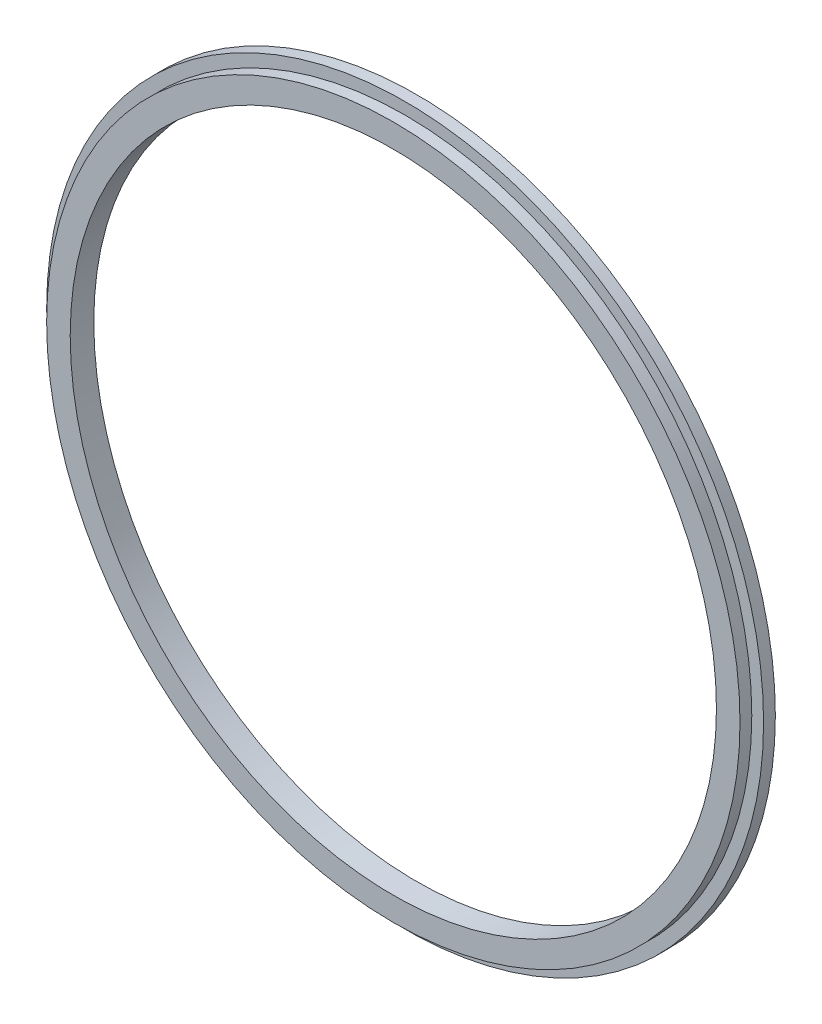
ISO-10303-21;
HEADER;
FILE_DESCRIPTION(('STEP AP214'),'2;1');
FILE_NAME('part.step','',(''),(''),'','','');
FILE_SCHEMA(('AUTOMOTIVE_DESIGN { 1 0 10303 214 1 1 1 1 }'));
ENDSEC;
DATA;
#1=APPLICATION_CONTEXT('core data for automotive mechanical design processes');
#2=APPLICATION_PROTOCOL_DEFINITION('international standard','automotive_design',2000,#1);
#3=PRODUCT_CONTEXT('',#1,'mechanical');
#4=PRODUCT('Part','Part','',(#3));
#5=PRODUCT_RELATED_PRODUCT_CATEGORY('part','',(#4));
#6=PRODUCT_DEFINITION_FORMATION('','',#4);
#7=PRODUCT_DEFINITION_CONTEXT('part definition',#1,'design');
#8=PRODUCT_DEFINITION('design','',#6,#7);
#9=PRODUCT_DEFINITION_SHAPE('','',#8);
#10=(LENGTH_UNIT() NAMED_UNIT(*) SI_UNIT(.MILLI.,.METRE.));
#11=(NAMED_UNIT(*) PLANE_ANGLE_UNIT() SI_UNIT($,.RADIAN.));
#12=(NAMED_UNIT(*) SI_UNIT($,.STERADIAN.) SOLID_ANGLE_UNIT());
#13=UNCERTAINTY_MEASURE_WITH_UNIT(LENGTH_MEASURE(1.E-05),#10,'distance_accuracy_value','');
#14=(GEOMETRIC_REPRESENTATION_CONTEXT(3) GLOBAL_UNCERTAINTY_ASSIGNED_CONTEXT((#13)) GLOBAL_UNIT_ASSIGNED_CONTEXT((#10,
#11,#12)) REPRESENTATION_CONTEXT('',''));
#15=CARTESIAN_POINT('',(0.,0.,0.));
#16=DIRECTION('',(0.,0.,1.));
#17=DIRECTION('',(1.,0.,0.));
#18=AXIS2_PLACEMENT_3D('',#15,#16,#17);
#19=CARTESIAN_POINT('',(0.,0.,2.));
#20=DIRECTION('',(0.,0.,1.));
#21=DIRECTION('',(1.,0.,0.));
#22=AXIS2_PLACEMENT_3D('',#19,#20,#21);
#23=PLANE('',#22);
#24=CARTESIAN_POINT('',(0.,0.,2.));
#25=DIRECTION('',(0.,0.,1.));
#26=DIRECTION('',(1.,0.,0.));
#27=AXIS2_PLACEMENT_3D('',#24,#25,#26);
#28=CIRCLE('',#27,58.829);
#29=CARTESIAN_POINT('',(58.829,0.,2.));
#30=VERTEX_POINT('',#29);
#31=EDGE_CURVE('E10',#30,#30,#28,.T.);
#32=ORIENTED_EDGE('',*,*,#31,.T.);
#33=EDGE_LOOP('',(#32));
#34=FACE_BOUND('',#33,.T.);
#35=CARTESIAN_POINT('',(0.,0.,2.));
#36=DIRECTION('',(0.,0.,1.));
#37=DIRECTION('',(1.,0.,0.));
#38=AXIS2_PLACEMENT_3D('',#35,#36,#37);
#39=CIRCLE('',#38,54.829);
#40=CARTESIAN_POINT('',(54.829,0.,2.));
#41=VERTEX_POINT('',#40);
#42=EDGE_CURVE('E49',#41,#41,#39,.T.);
#43=ORIENTED_EDGE('',*,*,#42,.F.);
#44=EDGE_LOOP('',(#43));
#45=FACE_BOUND('',#44,.T.);
#46=ADVANCED_FACE('F40',(#34,#45),#23,.T.);
#47=CARTESIAN_POINT('',(0.,0.,2.));
#48=DIRECTION('',(0.,0.,-1.));
#49=DIRECTION('',(-1.,0.,0.));
#50=AXIS2_PLACEMENT_3D('',#47,#48,#49);
#51=CYLINDRICAL_SURFACE('',#50,58.829);
#52=ORIENTED_EDGE('',*,*,#31,.F.);
#53=EDGE_LOOP('',(#52));
#54=FACE_BOUND('',#53,.T.);
#55=CARTESIAN_POINT('',(0.,0.,0.));
#56=DIRECTION('',(0.,0.,1.));
#57=DIRECTION('',(1.,0.,0.));
#58=AXIS2_PLACEMENT_3D('',#55,#56,#57);
#59=CIRCLE('',#58,58.829);
#60=CARTESIAN_POINT('',(58.829,0.,0.));
#61=VERTEX_POINT('',#60);
#62=EDGE_CURVE('E44',#61,#61,#59,.T.);
#63=ORIENTED_EDGE('',*,*,#62,.T.);
#64=EDGE_LOOP('',(#63));
#65=FACE_BOUND('',#64,.T.);
#66=ADVANCED_FACE('F42',(#54,#65),#51,.T.);
#67=CARTESIAN_POINT('',(0.,0.,2.));
#68=DIRECTION('',(0.,0.,-1.));
#69=DIRECTION('',(-1.,0.,0.));
#70=AXIS2_PLACEMENT_3D('',#67,#68,#69);
#71=CYLINDRICAL_SURFACE('',#70,54.829);
#72=ORIENTED_EDGE('',*,*,#42,.T.);
#73=EDGE_LOOP('',(#72));
#74=FACE_BOUND('',#73,.T.);
#75=CARTESIAN_POINT('',(0.,0.,-2.));
#76=DIRECTION('',(0.,0.,-1.));
#77=DIRECTION('',(-1.,0.,0.));
#78=AXIS2_PLACEMENT_3D('',#75,#76,#77);
#79=CIRCLE('',#78,54.829);
#80=CARTESIAN_POINT('',(-54.829,0.,-2.));
#81=VERTEX_POINT('',#80);
#82=EDGE_CURVE('E61',#81,#81,#79,.T.);
#83=ORIENTED_EDGE('',*,*,#82,.T.);
#84=EDGE_LOOP('',(#83));
#85=FACE_BOUND('',#84,.T.);
#86=ADVANCED_FACE('F69',(#74,#85),#71,.F.);
#87=CARTESIAN_POINT('',(0.,0.,-2.));
#88=DIRECTION('',(0.,0.,-1.));
#89=DIRECTION('',(-1.,0.,0.));
#90=AXIS2_PLACEMENT_3D('',#87,#88,#89);
#91=PLANE('',#90);
#92=CARTESIAN_POINT('',(0.,0.,-2.));
#93=DIRECTION('',(0.,0.,-1.));
#94=DIRECTION('',(-1.,0.,0.));
#95=AXIS2_PLACEMENT_3D('',#92,#93,#94);
#96=CIRCLE('',#95,60.829);
#97=CARTESIAN_POINT('',(-60.829,0.,-2.));
#98=VERTEX_POINT('',#97);
#99=EDGE_CURVE('E60',#98,#98,#96,.T.);
#100=ORIENTED_EDGE('',*,*,#99,.T.);
#101=EDGE_LOOP('',(#100));
#102=FACE_BOUND('',#101,.T.);
#103=ORIENTED_EDGE('',*,*,#82,.F.);
#104=EDGE_LOOP('',(#103));
#105=FACE_BOUND('',#104,.T.);
#106=ADVANCED_FACE('F71',(#102,#105),#91,.T.);
#107=CARTESIAN_POINT('',(0.,0.,0.));
#108=DIRECTION('',(0.,0.,-1.));
#109=DIRECTION('',(-1.,0.,0.));
#110=AXIS2_PLACEMENT_3D('',#107,#108,#109);
#111=PLANE('',#110);
#112=ORIENTED_EDGE('',*,*,#62,.F.);
#113=EDGE_LOOP('',(#112));
#114=FACE_BOUND('',#113,.T.);
#115=CARTESIAN_POINT('',(0.,0.,0.));
#116=DIRECTION('',(0.,0.,-1.));
#117=DIRECTION('',(-1.,0.,0.));
#118=AXIS2_PLACEMENT_3D('',#115,#116,#117);
#119=CIRCLE('',#118,60.829);
#120=CARTESIAN_POINT('',(-60.829,0.,0.));
#121=VERTEX_POINT('',#120);
#122=EDGE_CURVE('E56',#121,#121,#119,.T.);
#123=ORIENTED_EDGE('',*,*,#122,.F.);
#124=EDGE_LOOP('',(#123));
#125=FACE_BOUND('',#124,.T.);
#126=ADVANCED_FACE('F73',(#114,#125),#111,.F.);
#127=CARTESIAN_POINT('',(0.,0.,-2.));
#128=DIRECTION('',(0.,0.,1.));
#129=DIRECTION('',(1.,0.,0.));
#130=AXIS2_PLACEMENT_3D('',#127,#128,#129);
#131=CYLINDRICAL_SURFACE('',#130,60.829);
#132=ORIENTED_EDGE('',*,*,#99,.F.);
#133=EDGE_LOOP('',(#132));
#134=FACE_BOUND('',#133,.T.);
#135=ORIENTED_EDGE('',*,*,#122,.T.);
#136=EDGE_LOOP('',(#135));
#137=FACE_BOUND('',#136,.T.);
#138=ADVANCED_FACE('F80',(#134,#137),#131,.T.);
#139=CLOSED_SHELL('',(#46,#66,#86,#106,#126,#138));
#140=MANIFOLD_SOLID_BREP('B2',#139);
#141=ADVANCED_BREP_SHAPE_REPRESENTATION('',(#18,#140),#14);
#142=SHAPE_DEFINITION_REPRESENTATION(#9,#141);
ENDSEC;
END-ISO-10303-21;
